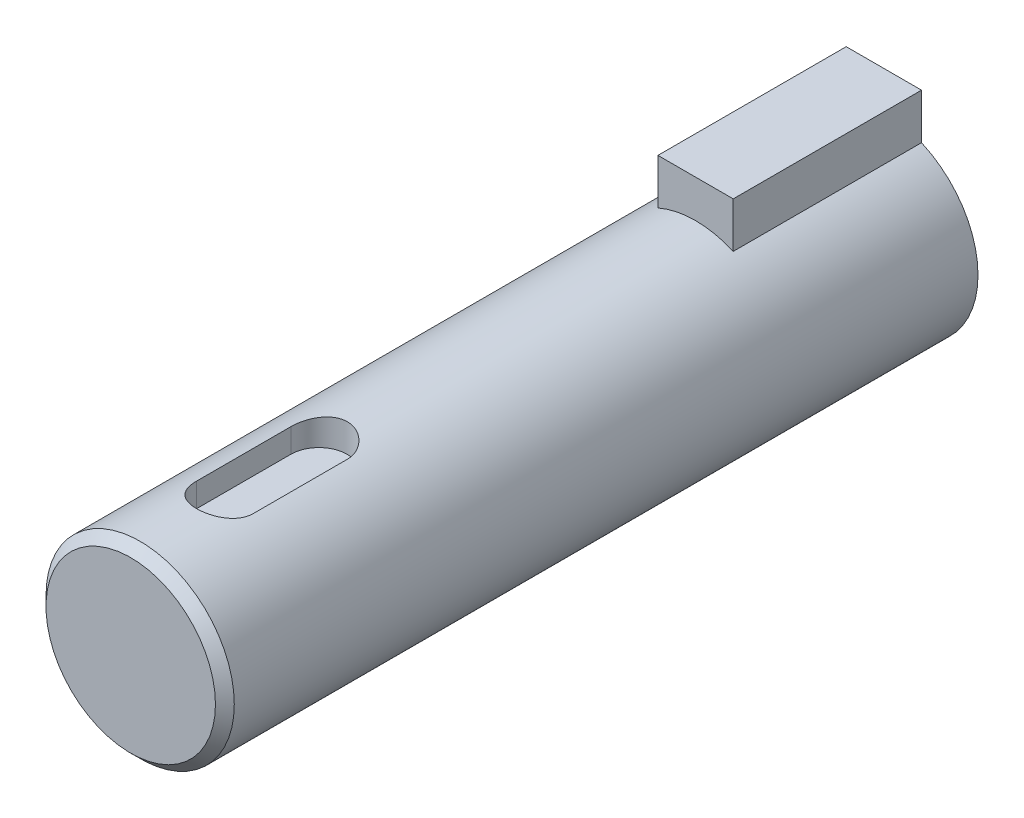
ISO-10303-21;
HEADER;
FILE_DESCRIPTION(('STEP AP214'),'2;1');
FILE_NAME('part.step','',(''),(''),'','','');
FILE_SCHEMA(('AUTOMOTIVE_DESIGN { 1 0 10303 214 1 1 1 1 }'));
ENDSEC;
DATA;
#1=APPLICATION_CONTEXT('core data for automotive mechanical design processes');
#2=APPLICATION_PROTOCOL_DEFINITION('international standard','automotive_design',2000,#1);
#3=PRODUCT_CONTEXT('',#1,'mechanical');
#4=PRODUCT('Part','Part','',(#3));
#5=PRODUCT_RELATED_PRODUCT_CATEGORY('part','',(#4));
#6=PRODUCT_DEFINITION_FORMATION('','',#4);
#7=PRODUCT_DEFINITION_CONTEXT('part definition',#1,'design');
#8=PRODUCT_DEFINITION('design','',#6,#7);
#9=PRODUCT_DEFINITION_SHAPE('','',#8);
#10=(LENGTH_UNIT() NAMED_UNIT(*) SI_UNIT(.MILLI.,.METRE.));
#11=(NAMED_UNIT(*) PLANE_ANGLE_UNIT() SI_UNIT($,.RADIAN.));
#12=(NAMED_UNIT(*) SI_UNIT($,.STERADIAN.) SOLID_ANGLE_UNIT());
#13=UNCERTAINTY_MEASURE_WITH_UNIT(LENGTH_MEASURE(1.E-05),#10,'distance_accuracy_value','');
#14=(GEOMETRIC_REPRESENTATION_CONTEXT(3) GLOBAL_UNCERTAINTY_ASSIGNED_CONTEXT((#13)) GLOBAL_UNIT_ASSIGNED_CONTEXT((#10,
#11,#12)) REPRESENTATION_CONTEXT('',''));
#15=CARTESIAN_POINT('',(0.,0.,0.));
#16=DIRECTION('',(0.,0.,1.));
#17=DIRECTION('',(1.,0.,0.));
#18=AXIS2_PLACEMENT_3D('',#15,#16,#17);
#19=CARTESIAN_POINT('',(0.,0.,10.));
#20=DIRECTION('',(0.,0.,-1.));
#21=DIRECTION('',(-1.,0.,0.));
#22=AXIS2_PLACEMENT_3D('',#19,#20,#21);
#23=CYLINDRICAL_SURFACE('',#22,5.);
#24=CARTESIAN_POINT('',(0.,0.,39.5));
#25=DIRECTION('',(0.,0.,1.));
#26=DIRECTION('',(1.,0.,0.));
#27=AXIS2_PLACEMENT_3D('',#24,#25,#26);
#28=CIRCLE('',#27,5.);
#29=CARTESIAN_POINT('',(5.,0.,39.5));
#30=VERTEX_POINT('',#29);
#31=EDGE_CURVE('E11',#30,#30,#28,.F.);
#32=ORIENTED_EDGE('',*,*,#31,.T.);
#33=EDGE_LOOP('',(#32));
#34=FACE_BOUND('',#33,.T.);
#35=CARTESIAN_POINT('',(0.,0.,0.));
#36=DIRECTION('',(0.,0.,1.));
#37=DIRECTION('',(1.,0.,0.));
#38=AXIS2_PLACEMENT_3D('',#35,#36,#37);
#39=CIRCLE('',#38,5.);
#40=CARTESIAN_POINT('',(-2.,4.58257569495584,0.));
#41=VERTEX_POINT('',#40);
#42=CARTESIAN_POINT('',(2.,4.58257569495584,0.));
#43=VERTEX_POINT('',#42);
#44=EDGE_CURVE('E149',#41,#43,#39,.T.);
#45=ORIENTED_EDGE('',*,*,#44,.T.);
#46=DIRECTION('',(0.,0.,-1.));
#47=VECTOR('',#46,1.);
#48=CARTESIAN_POINT('',(2.,4.58257569495584,10.));
#49=LINE('',#48,#47);
#50=CARTESIAN_POINT('',(2.,4.58257569495584,10.));
#51=VERTEX_POINT('',#50);
#52=EDGE_CURVE('E157',#51,#43,#49,.T.);
#53=ORIENTED_EDGE('',*,*,#52,.F.);
#54=CARTESIAN_POINT('',(0.,0.,10.));
#55=DIRECTION('',(0.,0.,1.));
#56=DIRECTION('',(1.,0.,0.));
#57=AXIS2_PLACEMENT_3D('',#54,#55,#56);
#58=CIRCLE('',#57,5.);
#59=CARTESIAN_POINT('',(-2.,4.58257569495584,10.));
#60=VERTEX_POINT('',#59);
#61=EDGE_CURVE('E116',#51,#60,#58,.T.);
#62=ORIENTED_EDGE('',*,*,#61,.T.);
#63=DIRECTION('',(0.,0.,-1.));
#64=VECTOR('',#63,1.);
#65=CARTESIAN_POINT('',(-2.,4.58257569495584,10.));
#66=LINE('',#65,#64);
#67=EDGE_CURVE('E160',#60,#41,#66,.T.);
#68=ORIENTED_EDGE('',*,*,#67,.T.);
#69=EDGE_LOOP('',(#45,#53,#62,#68));
#70=FACE_BOUND('',#69,.T.);
#71=CARTESIAN_POINT('',(1.5,4.76969600708473,30.));
#72=CARTESIAN_POINT('',(1.50000085357071,4.76969249084934,29.958820607092));
#73=CARTESIAN_POINT('',(1.49830317083428,4.77022997000129,29.9176619568739));
#74=CARTESIAN_POINT('',(1.49153785660317,4.77235095109999,29.8356588379044));
#75=CARTESIAN_POINT('',(1.48647098275841,4.77393421787376,29.7948143006051));
#76=CARTESIAN_POINT('',(1.46630203689311,4.78018490618873,29.6734094590453));
#77=CARTESIAN_POINT('',(1.44623120413662,4.78635370384275,29.5936936095836));
#78=CARTESIAN_POINT('',(1.39353102315626,4.80195952113208,29.4389644216141));
#79=CARTESIAN_POINT('',(1.36090607068203,4.81139539670393,29.3639494478019));
#80=CARTESIAN_POINT('',(1.28407841117655,4.83246571212052,29.2204033184024));
#81=CARTESIAN_POINT('',(1.23987031651226,4.84410117434933,29.1518752002716));
#82=CARTESIAN_POINT('',(1.13964850658326,4.86866835244721,29.021133944003));
#83=CARTESIAN_POINT('',(1.08333433465208,4.88162755412974,28.9591563396566));
#84=CARTESIAN_POINT('',(0.961138919873355,4.90714811559049,28.8453644161));
#85=CARTESIAN_POINT('',(0.895256063916348,4.91970940785249,28.7935518139969));
#86=CARTESIAN_POINT('',(0.75410992131543,4.94333239727705,28.7005362296815));
#87=CARTESIAN_POINT('',(0.678680819336259,4.95435770971354,28.6595748197021));
#88=CARTESIAN_POINT('',(0.521621185505774,4.97334469846208,28.5910115883818));
#89=CARTESIAN_POINT('',(0.439992259012927,4.98130716463903,28.5634063222057));
#90=CARTESIAN_POINT('',(0.275324697874878,4.99307639935002,28.523120200898));
#91=CARTESIAN_POINT('',(0.192393125294253,4.99699549276993,28.5100351420303));
#92=CARTESIAN_POINT('',(0.0254235719980818,5.00063202022426,28.4978826586367));
#93=CARTESIAN_POINT('',(-0.0586141962423625,5.00035024971471,28.4988125802998));
#94=CARTESIAN_POINT('',(-0.222571599946017,4.99569602566267,28.514392908759));
#95=CARTESIAN_POINT('',(-0.302537145464641,4.99145415509187,28.5286053449787));
#96=CARTESIAN_POINT('',(-0.458890052102026,4.9795151369998,28.5696316352381));
#97=CARTESIAN_POINT('',(-0.535277225531999,4.97181780846028,28.5964461494559));
#98=CARTESIAN_POINT('',(-0.683347815892217,4.95365214926145,28.6622122216464));
#99=CARTESIAN_POINT('',(-0.754966006044143,4.94315255692525,28.7013016443569));
#100=CARTESIAN_POINT('',(-0.890765529574421,4.92049624651755,28.7903985900483));
#101=CARTESIAN_POINT('',(-0.954945191614596,4.90833915735884,28.8404085594788));
#102=CARTESIAN_POINT('',(-1.07665450541275,4.88311673571409,28.9521919880835));
#103=CARTESIAN_POINT('',(-1.13383351478034,4.87003445449553,29.0143438637607));
#104=CARTESIAN_POINT('',(-1.23706769492487,4.84484215114658,29.1474974234279));
#105=CARTESIAN_POINT('',(-1.28311962013078,4.83273241337565,29.2185016803655));
#106=CARTESIAN_POINT('',(-1.36316407240863,4.81077228795653,29.3682809284493));
#107=CARTESIAN_POINT('',(-1.39703006341135,4.80094596245948,29.4471271795934));
#108=CARTESIAN_POINT('',(-1.45085886004699,4.78495663653201,29.6097245039817));
#109=CARTESIAN_POINT('',(-1.47084293218035,4.77878803475875,29.6934678607144));
#110=CARTESIAN_POINT('',(-1.4890120359008,4.77314032325006,29.8149948890702));
#111=CARTESIAN_POINT('',(-1.49313202989009,4.77185156275267,29.8518907341796));
#112=CARTESIAN_POINT('',(-1.49862355614854,4.77012928611782,29.9258514790995));
#113=CARTESIAN_POINT('',(-1.49999912968269,4.76969451246644,29.9629160496639));
#114=CARTESIAN_POINT('',(-1.5,4.76969600708473,30.));
#115=B_SPLINE_CURVE_WITH_KNOTS('',3,(#71,#72,#73,#74,#75,#76,#77,#78,#79,#80,#81,#82,#83,#84,
#85,#86,#87,#88,#89,#90,#91,#92,#93,#94,#95,#96,#97,#98,#99,#100,#101,#102,#103,#104,#105,#106,
#107,#108,#109,#110,#111,#112,#113,#114),.UNSPECIFIED.,.F.,.F.,(4,2,2,2,2,2,2,2,2,2,2,2,2,2,2,2,
2,2,2,2,2,4),(0.,0.123459071219737,0.246890388853047,0.492911349615212,0.73884624588433,
0.984895736828095,1.23795510798803,1.49105719006936,1.74939356197455,2.00766326783256,
2.25854751319802,2.5093842528947,2.75223130012966,2.99509107067836,3.2407824256273,
3.48652887757005,3.74172568310981,3.99699683536777,4.25484698071527,4.51230123440207,
4.62365084745809,4.73483637253616),.UNSPECIFIED.);
#116=CARTESIAN_POINT('',(1.5,4.76969600708473,30.));
#117=VERTEX_POINT('',#116);
#118=CARTESIAN_POINT('',(-1.5,4.76969600708473,30.));
#119=VERTEX_POINT('',#118);
#120=EDGE_CURVE('E113',#117,#119,#115,.T.);
#121=ORIENTED_EDGE('',*,*,#120,.F.);
#122=DIRECTION('',(0.,0.,-1.));
#123=VECTOR('',#122,1.);
#124=CARTESIAN_POINT('',(1.5,4.76969600708473,10.));
#125=LINE('',#124,#123);
#126=CARTESIAN_POINT('',(1.5,4.76969600708473,35.));
#127=VERTEX_POINT('',#126);
#128=EDGE_CURVE('E163',#127,#117,#125,.T.);
#129=ORIENTED_EDGE('',*,*,#128,.F.);
#130=CARTESIAN_POINT('',(-1.5,4.76969600708473,35.));
#131=CARTESIAN_POINT('',(-1.50000085357071,4.76969249084934,35.041179392908));
#132=CARTESIAN_POINT('',(-1.49830317083428,4.77022997000129,35.0823380431261));
#133=CARTESIAN_POINT('',(-1.49153785660316,4.77235095109999,35.1643411620956));
#134=CARTESIAN_POINT('',(-1.48647098275841,4.77393421787376,35.2051856993949));
#135=CARTESIAN_POINT('',(-1.46630203689311,4.78018490618873,35.3265905409547));
#136=CARTESIAN_POINT('',(-1.44623120413662,4.78635370384275,35.4063063904164));
#137=CARTESIAN_POINT('',(-1.39353102315626,4.80195952113208,35.5610355783859));
#138=CARTESIAN_POINT('',(-1.36090607068203,4.81139539670393,35.6360505521981));
#139=CARTESIAN_POINT('',(-1.28407841117655,4.83246571212052,35.7795966815976));
#140=CARTESIAN_POINT('',(-1.23987031651226,4.84410117434933,35.8481247997284));
#141=CARTESIAN_POINT('',(-1.13964850658326,4.86866835244721,35.9788660559971));
#142=CARTESIAN_POINT('',(-1.08333433465208,4.88162755412974,36.0408436603434));
#143=CARTESIAN_POINT('',(-0.961138919873352,4.90714811559049,36.1546355839));
#144=CARTESIAN_POINT('',(-0.895256063916347,4.91970940785249,36.2064481860031));
#145=CARTESIAN_POINT('',(-0.754109921315428,4.94333239727705,36.2994637703185));
#146=CARTESIAN_POINT('',(-0.678680819336256,4.95435770971354,36.340425180298));
#147=CARTESIAN_POINT('',(-0.521621185505771,4.97334469846208,36.4089884116182));
#148=CARTESIAN_POINT('',(-0.439992259012925,4.98130716463903,36.4365936777943));
#149=CARTESIAN_POINT('',(-0.275324697874877,4.99307639935002,36.4768797991021));
#150=CARTESIAN_POINT('',(-0.192393125294251,4.99699549276993,36.4899648579698));
#151=CARTESIAN_POINT('',(-0.0254235719980789,5.00063202022426,36.5021173413633));
#152=CARTESIAN_POINT('',(0.0586141962423654,5.00035024971471,36.5011874197002));
#153=CARTESIAN_POINT('',(0.22257159994602,4.99569602566267,36.485607091241));
#154=CARTESIAN_POINT('',(0.302537145464644,4.99145415509187,36.4713946550213));
#155=CARTESIAN_POINT('',(0.458890052102028,4.9795151369998,36.4303683647619));
#156=CARTESIAN_POINT('',(0.535277225532,4.97181780846028,36.4035538505441));
#157=CARTESIAN_POINT('',(0.683347815892217,4.95365214926145,36.3377877783536));
#158=CARTESIAN_POINT('',(0.754966006044142,4.94315255692525,36.2986983556431));
#159=CARTESIAN_POINT('',(0.89076552957442,4.92049624651755,36.2096014099517));
#160=CARTESIAN_POINT('',(0.954945191614595,4.90833915735884,36.1595914405212));
#161=CARTESIAN_POINT('',(1.07665450541275,4.88311673571409,36.0478080119165));
#162=CARTESIAN_POINT('',(1.13383351478034,4.87003445449554,35.9856561362393));
#163=CARTESIAN_POINT('',(1.23706769492487,4.84484215114658,35.8525025765721));
#164=CARTESIAN_POINT('',(1.28311962013078,4.83273241337565,35.7814983196345));
#165=CARTESIAN_POINT('',(1.36316407240863,4.81077228795653,35.6317190715507));
#166=CARTESIAN_POINT('',(1.39703006341135,4.80094596245948,35.5528728204066));
#167=CARTESIAN_POINT('',(1.45085886004699,4.78495663653201,35.3902754960183));
#168=CARTESIAN_POINT('',(1.47084293218036,4.77878803475875,35.3065321392856));
#169=CARTESIAN_POINT('',(1.4890120359008,4.77314032325006,35.1850051109298));
#170=CARTESIAN_POINT('',(1.49313202989009,4.77185156275267,35.1481092658204));
#171=CARTESIAN_POINT('',(1.49862355614854,4.77012928611782,35.0741485209005));
#172=CARTESIAN_POINT('',(1.49999912968269,4.76969451246644,35.0370839503361));
#173=CARTESIAN_POINT('',(1.5,4.76969600708473,35.));
#174=B_SPLINE_CURVE_WITH_KNOTS('',3,(#130,#131,#132,#133,#134,#135,#136,#137,#138,#139,#140,
#141,#142,#143,#144,#145,#146,#147,#148,#149,#150,#151,#152,#153,#154,#155,#156,#157,#158,#159,
#160,#161,#162,#163,#164,#165,#166,#167,#168,#169,#170,#171,#172,#173),.UNSPECIFIED.,.F.,.F.,(4,
2,2,2,2,2,2,2,2,2,2,2,2,2,2,2,2,2,2,2,2,4),(0.,0.123459071219744,0.246890388853047,
0.492911349615212,0.738846245884322,0.984895736828089,1.23795510798803,1.49105719006936,
1.74939356197455,2.00766326783256,2.25854751319802,2.50938425289471,2.75223130012966,
2.99509107067836,3.2407824256273,3.48652887757005,3.74172568310981,3.99699683536778,
4.25484698071527,4.51230123440207,4.62365084745808,4.73483637253615),.UNSPECIFIED.);
#175=CARTESIAN_POINT('',(-1.5,4.76969600708473,35.));
#176=VERTEX_POINT('',#175);
#177=EDGE_CURVE('E165',#176,#127,#174,.T.);
#178=ORIENTED_EDGE('',*,*,#177,.F.);
#179=DIRECTION('',(0.,0.,-1.));
#180=VECTOR('',#179,1.);
#181=CARTESIAN_POINT('',(-1.5,4.76969600708473,10.));
#182=LINE('',#181,#180);
#183=EDGE_CURVE('E172',#119,#176,#182,.F.);
#184=ORIENTED_EDGE('',*,*,#183,.F.);
#185=EDGE_LOOP('',(#121,#129,#178,#184));
#186=FACE_BOUND('',#185,.T.);
#187=ADVANCED_FACE('F32',(#34,#70,#186),#23,.T.);
#188=CARTESIAN_POINT('',(-2.,7.,10.));
#189=DIRECTION('',(1.,0.,0.));
#190=DIRECTION('',(0.,1.,0.));
#191=AXIS2_PLACEMENT_3D('',#188,#189,#190);
#192=PLANE('',#191);
#193=DIRECTION('',(0.,-1.,0.));
#194=VECTOR('',#193,1.);
#195=CARTESIAN_POINT('',(-2.,7.,0.));
#196=LINE('',#195,#194);
#197=CARTESIAN_POINT('',(-2.,7.,0.));
#198=VERTEX_POINT('',#197);
#199=EDGE_CURVE('E141',#198,#41,#196,.T.);
#200=ORIENTED_EDGE('',*,*,#199,.T.);
#201=ORIENTED_EDGE('',*,*,#67,.F.);
#202=DIRECTION('',(0.,-1.,0.));
#203=VECTOR('',#202,1.);
#204=CARTESIAN_POINT('',(-2.,7.,10.));
#205=LINE('',#204,#203);
#206=CARTESIAN_POINT('',(-2.,7.,10.));
#207=VERTEX_POINT('',#206);
#208=EDGE_CURVE('E80',#207,#60,#205,.T.);
#209=ORIENTED_EDGE('',*,*,#208,.F.);
#210=DIRECTION('',(0.,0.,-1.));
#211=VECTOR('',#210,1.);
#212=CARTESIAN_POINT('',(-2.,7.,10.));
#213=LINE('',#212,#211);
#214=EDGE_CURVE('E146',#207,#198,#213,.T.);
#215=ORIENTED_EDGE('',*,*,#214,.T.);
#216=EDGE_LOOP('',(#200,#201,#209,#215));
#217=FACE_BOUND('',#216,.T.);
#218=ADVANCED_FACE('F205',(#217),#192,.F.);
#219=CARTESIAN_POINT('',(2.,7.,10.));
#220=DIRECTION('',(-1.,0.,0.));
#221=DIRECTION('',(0.,-1.,0.));
#222=AXIS2_PLACEMENT_3D('',#219,#220,#221);
#223=PLANE('',#222);
#224=DIRECTION('',(0.,1.,0.));
#225=VECTOR('',#224,1.);
#226=CARTESIAN_POINT('',(2.,7.,0.));
#227=LINE('',#226,#225);
#228=CARTESIAN_POINT('',(2.,7.,0.));
#229=VERTEX_POINT('',#228);
#230=EDGE_CURVE('E151',#43,#229,#227,.T.);
#231=ORIENTED_EDGE('',*,*,#230,.T.);
#232=DIRECTION('',(0.,0.,-1.));
#233=VECTOR('',#232,1.);
#234=CARTESIAN_POINT('',(2.,7.,10.));
#235=LINE('',#234,#233);
#236=CARTESIAN_POINT('',(2.,7.,10.));
#237=VERTEX_POINT('',#236);
#238=EDGE_CURVE('E155',#237,#229,#235,.T.);
#239=ORIENTED_EDGE('',*,*,#238,.F.);
#240=DIRECTION('',(0.,1.,0.));
#241=VECTOR('',#240,1.);
#242=CARTESIAN_POINT('',(2.,7.,10.));
#243=LINE('',#242,#241);
#244=EDGE_CURVE('E143',#51,#237,#243,.T.);
#245=ORIENTED_EDGE('',*,*,#244,.F.);
#246=ORIENTED_EDGE('',*,*,#52,.T.);
#247=EDGE_LOOP('',(#231,#239,#245,#246));
#248=FACE_BOUND('',#247,.T.);
#249=ADVANCED_FACE('F210',(#248),#223,.F.);
#250=CARTESIAN_POINT('',(-2.,7.,10.));
#251=DIRECTION('',(0.,-1.,0.));
#252=DIRECTION('',(0.,0.,-1.));
#253=AXIS2_PLACEMENT_3D('',#250,#251,#252);
#254=PLANE('',#253);
#255=DIRECTION('',(-1.,0.,0.));
#256=VECTOR('',#255,1.);
#257=CARTESIAN_POINT('',(-2.,7.,0.));
#258=LINE('',#257,#256);
#259=EDGE_CURVE('E76',#229,#198,#258,.T.);
#260=ORIENTED_EDGE('',*,*,#259,.T.);
#261=ORIENTED_EDGE('',*,*,#214,.F.);
#262=DIRECTION('',(-1.,0.,0.));
#263=VECTOR('',#262,1.);
#264=CARTESIAN_POINT('',(-2.,7.,10.));
#265=LINE('',#264,#263);
#266=EDGE_CURVE('E56',#237,#207,#265,.T.);
#267=ORIENTED_EDGE('',*,*,#266,.F.);
#268=ORIENTED_EDGE('',*,*,#238,.T.);
#269=EDGE_LOOP('',(#260,#261,#267,#268));
#270=FACE_BOUND('',#269,.T.);
#271=ADVANCED_FACE('F275',(#270),#254,.F.);
#272=CARTESIAN_POINT('',(0.,0.,10.));
#273=DIRECTION('',(0.,0.,1.));
#274=DIRECTION('',(1.,0.,0.));
#275=AXIS2_PLACEMENT_3D('',#272,#273,#274);
#276=PLANE('',#275);
#277=ORIENTED_EDGE('',*,*,#61,.F.);
#278=ORIENTED_EDGE('',*,*,#244,.T.);
#279=ORIENTED_EDGE('',*,*,#266,.T.);
#280=ORIENTED_EDGE('',*,*,#208,.T.);
#281=EDGE_LOOP('',(#277,#278,#279,#280));
#282=FACE_BOUND('',#281,.T.);
#283=ADVANCED_FACE('F271',(#282),#276,.T.);
#284=CARTESIAN_POINT('',(0.,0.,0.));
#285=DIRECTION('',(0.,0.,1.));
#286=DIRECTION('',(1.,0.,0.));
#287=AXIS2_PLACEMENT_3D('',#284,#285,#286);
#288=PLANE('',#287);
#289=ORIENTED_EDGE('',*,*,#199,.F.);
#290=ORIENTED_EDGE('',*,*,#259,.F.);
#291=ORIENTED_EDGE('',*,*,#230,.F.);
#292=ORIENTED_EDGE('',*,*,#44,.F.);
#293=EDGE_LOOP('',(#289,#290,#291,#292));
#294=FACE_BOUND('',#293,.T.);
#295=ADVANCED_FACE('F241',(#294),#288,.F.);
#296=CARTESIAN_POINT('',(0.,0.,40.));
#297=DIRECTION('',(0.,0.,1.));
#298=DIRECTION('',(1.,0.,0.));
#299=AXIS2_PLACEMENT_3D('',#296,#297,#298);
#300=PLANE('',#299);
#301=CARTESIAN_POINT('',(0.,0.,40.));
#302=DIRECTION('',(0.,0.,1.));
#303=DIRECTION('',(1.,0.,0.));
#304=AXIS2_PLACEMENT_3D('',#301,#302,#303);
#305=CIRCLE('',#304,4.5);
#306=CARTESIAN_POINT('',(4.5,0.,40.));
#307=VERTEX_POINT('',#306);
#308=EDGE_CURVE('E40',#307,#307,#305,.T.);
#309=ORIENTED_EDGE('',*,*,#308,.T.);
#310=EDGE_LOOP('',(#309));
#311=FACE_BOUND('',#310,.T.);
#312=ADVANCED_FACE('F189',(#311),#300,.T.);
#313=CARTESIAN_POINT('',(0.,7.,30.));
#314=DIRECTION('',(0.,-1.,0.));
#315=DIRECTION('',(0.,0.,-1.));
#316=AXIS2_PLACEMENT_3D('',#313,#314,#315);
#317=CYLINDRICAL_SURFACE('',#316,1.5);
#318=ORIENTED_EDGE('',*,*,#120,.T.);
#319=DIRECTION('',(0.,-1.,0.));
#320=VECTOR('',#319,1.);
#321=CARTESIAN_POINT('',(-1.5,7.,30.));
#322=LINE('',#321,#320);
#323=CARTESIAN_POINT('',(-1.5,3.5,30.));
#324=VERTEX_POINT('',#323);
#325=EDGE_CURVE('E106',#119,#324,#322,.T.);
#326=ORIENTED_EDGE('',*,*,#325,.T.);
#327=CARTESIAN_POINT('',(0.,3.5,30.));
#328=DIRECTION('',(0.,1.,0.));
#329=DIRECTION('',(0.,0.,1.));
#330=AXIS2_PLACEMENT_3D('',#327,#328,#329);
#331=CIRCLE('',#330,1.5);
#332=CARTESIAN_POINT('',(1.5,3.5,30.));
#333=VERTEX_POINT('',#332);
#334=EDGE_CURVE('E111',#333,#324,#331,.T.);
#335=ORIENTED_EDGE('',*,*,#334,.F.);
#336=DIRECTION('',(0.,-1.,0.));
#337=VECTOR('',#336,1.);
#338=CARTESIAN_POINT('',(1.5,7.,30.));
#339=LINE('',#338,#337);
#340=EDGE_CURVE('E135',#117,#333,#339,.T.);
#341=ORIENTED_EDGE('',*,*,#340,.F.);
#342=EDGE_LOOP('',(#318,#326,#335,#341));
#343=FACE_BOUND('',#342,.T.);
#344=ADVANCED_FACE('F108',(#343),#317,.F.);
#345=CARTESIAN_POINT('',(-1.5,7.,30.));
#346=DIRECTION('',(1.,0.,0.));
#347=DIRECTION('',(0.,0.,-1.));
#348=AXIS2_PLACEMENT_3D('',#345,#346,#347);
#349=PLANE('',#348);
#350=ORIENTED_EDGE('',*,*,#183,.T.);
#351=DIRECTION('',(0.,-1.,0.));
#352=VECTOR('',#351,1.);
#353=CARTESIAN_POINT('',(-1.5,7.,35.));
#354=LINE('',#353,#352);
#355=CARTESIAN_POINT('',(-1.5,3.5,35.));
#356=VERTEX_POINT('',#355);
#357=EDGE_CURVE('E117',#176,#356,#354,.T.);
#358=ORIENTED_EDGE('',*,*,#357,.T.);
#359=DIRECTION('',(0.,0.,1.));
#360=VECTOR('',#359,1.);
#361=CARTESIAN_POINT('',(-1.5,3.5,30.));
#362=LINE('',#361,#360);
#363=EDGE_CURVE('E120',#324,#356,#362,.T.);
#364=ORIENTED_EDGE('',*,*,#363,.F.);
#365=ORIENTED_EDGE('',*,*,#325,.F.);
#366=EDGE_LOOP('',(#350,#358,#364,#365));
#367=FACE_BOUND('',#366,.T.);
#368=ADVANCED_FACE('F121',(#367),#349,.T.);
#369=CARTESIAN_POINT('',(0.,7.,35.));
#370=DIRECTION('',(0.,-1.,0.));
#371=DIRECTION('',(0.,0.,-1.));
#372=AXIS2_PLACEMENT_3D('',#369,#370,#371);
#373=CYLINDRICAL_SURFACE('',#372,1.5);
#374=ORIENTED_EDGE('',*,*,#177,.T.);
#375=DIRECTION('',(0.,-1.,0.));
#376=VECTOR('',#375,1.);
#377=CARTESIAN_POINT('',(1.5,7.,35.));
#378=LINE('',#377,#376);
#379=CARTESIAN_POINT('',(1.5,3.5,35.));
#380=VERTEX_POINT('',#379);
#381=EDGE_CURVE('E47',#127,#380,#378,.T.);
#382=ORIENTED_EDGE('',*,*,#381,.T.);
#383=CARTESIAN_POINT('',(0.,3.5,35.));
#384=DIRECTION('',(0.,1.,0.));
#385=DIRECTION('',(0.,0.,1.));
#386=AXIS2_PLACEMENT_3D('',#383,#384,#385);
#387=CIRCLE('',#386,1.5);
#388=EDGE_CURVE('E126',#356,#380,#387,.T.);
#389=ORIENTED_EDGE('',*,*,#388,.F.);
#390=ORIENTED_EDGE('',*,*,#357,.F.);
#391=EDGE_LOOP('',(#374,#382,#389,#390));
#392=FACE_BOUND('',#391,.T.);
#393=ADVANCED_FACE('F176',(#392),#373,.F.);
#394=CARTESIAN_POINT('',(1.5,7.,30.));
#395=DIRECTION('',(-1.,0.,0.));
#396=DIRECTION('',(0.,0.,1.));
#397=AXIS2_PLACEMENT_3D('',#394,#395,#396);
#398=PLANE('',#397);
#399=ORIENTED_EDGE('',*,*,#128,.T.);
#400=ORIENTED_EDGE('',*,*,#340,.T.);
#401=DIRECTION('',(0.,0.,-1.));
#402=VECTOR('',#401,1.);
#403=CARTESIAN_POINT('',(1.5,3.5,30.));
#404=LINE('',#403,#402);
#405=EDGE_CURVE('E130',#380,#333,#404,.T.);
#406=ORIENTED_EDGE('',*,*,#405,.F.);
#407=ORIENTED_EDGE('',*,*,#381,.F.);
#408=EDGE_LOOP('',(#399,#400,#406,#407));
#409=FACE_BOUND('',#408,.T.);
#410=ADVANCED_FACE('F181',(#409),#398,.T.);
#411=CARTESIAN_POINT('',(0.,3.5,30.));
#412=DIRECTION('',(0.,1.,0.));
#413=DIRECTION('',(0.,0.,1.));
#414=AXIS2_PLACEMENT_3D('',#411,#412,#413);
#415=PLANE('',#414);
#416=ORIENTED_EDGE('',*,*,#334,.T.);
#417=ORIENTED_EDGE('',*,*,#363,.T.);
#418=ORIENTED_EDGE('',*,*,#388,.T.);
#419=ORIENTED_EDGE('',*,*,#405,.T.);
#420=EDGE_LOOP('',(#416,#417,#418,#419));
#421=FACE_BOUND('',#420,.T.);
#422=ADVANCED_FACE('F129',(#421),#415,.T.);
#423=CARTESIAN_POINT('',(0.,0.,40.));
#424=DIRECTION('',(0.,0.,-1.));
#425=DIRECTION('',(-1.,0.,0.));
#426=AXIS2_PLACEMENT_3D('',#423,#424,#425);
#427=CONICAL_SURFACE('',#426,4.5,0.785398163397457);
#428=ORIENTED_EDGE('',*,*,#31,.F.);
#429=EDGE_LOOP('',(#428));
#430=FACE_BOUND('',#429,.T.);
#431=ORIENTED_EDGE('',*,*,#308,.F.);
#432=EDGE_LOOP('',(#431));
#433=FACE_BOUND('',#432,.T.);
#434=ADVANCED_FACE('F34',(#430,#433),#427,.T.);
#435=CLOSED_SHELL('',(#187,#218,#249,#271,#283,#295,#312,#344,#368,#393,#410,#422,#434));
#436=MANIFOLD_SOLID_BREP('B2',#435);
#437=ADVANCED_BREP_SHAPE_REPRESENTATION('',(#18,#436),#14);
#438=SHAPE_DEFINITION_REPRESENTATION(#9,#437);
ENDSEC;
END-ISO-10303-21;
